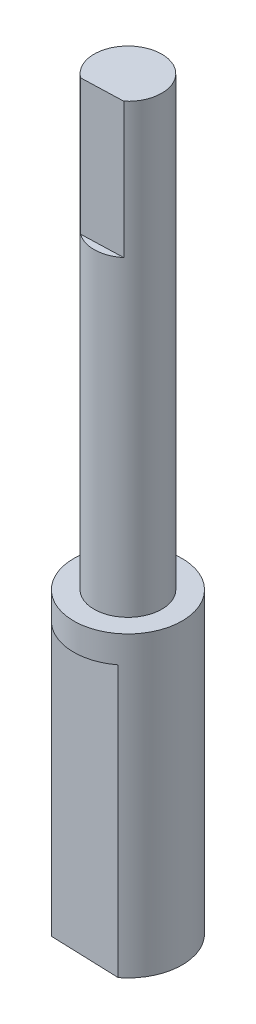
ISO-10303-21;
HEADER;
FILE_DESCRIPTION(('STEP AP214'),'2;1');
FILE_NAME('part.step','',(''),(''),'','','');
FILE_SCHEMA(('AUTOMOTIVE_DESIGN { 1 0 10303 214 1 1 1 1 }'));
ENDSEC;
DATA;
#1=APPLICATION_CONTEXT('core data for automotive mechanical design processes');
#2=APPLICATION_PROTOCOL_DEFINITION('international standard','automotive_design',2000,#1);
#3=PRODUCT_CONTEXT('',#1,'mechanical');
#4=PRODUCT('Part','Part','',(#3));
#5=PRODUCT_RELATED_PRODUCT_CATEGORY('part','',(#4));
#6=PRODUCT_DEFINITION_FORMATION('','',#4);
#7=PRODUCT_DEFINITION_CONTEXT('part definition',#1,'design');
#8=PRODUCT_DEFINITION('design','',#6,#7);
#9=PRODUCT_DEFINITION_SHAPE('','',#8);
#10=(LENGTH_UNIT() NAMED_UNIT(*) SI_UNIT(.MILLI.,.METRE.));
#11=(NAMED_UNIT(*) PLANE_ANGLE_UNIT() SI_UNIT($,.RADIAN.));
#12=(NAMED_UNIT(*) SI_UNIT($,.STERADIAN.) SOLID_ANGLE_UNIT());
#13=UNCERTAINTY_MEASURE_WITH_UNIT(LENGTH_MEASURE(1.E-05),#10,'distance_accuracy_value','');
#14=(GEOMETRIC_REPRESENTATION_CONTEXT(3) GLOBAL_UNCERTAINTY_ASSIGNED_CONTEXT((#13)) GLOBAL_UNIT_ASSIGNED_CONTEXT((#10,
#11,#12)) REPRESENTATION_CONTEXT('',''));
#15=CARTESIAN_POINT('',(0.,0.,0.));
#16=DIRECTION('',(0.,0.,1.));
#17=DIRECTION('',(1.,0.,0.));
#18=AXIS2_PLACEMENT_3D('',#15,#16,#17);
#19=CARTESIAN_POINT('',(0.,55.,0.));
#20=DIRECTION('',(0.,-1.,0.));
#21=DIRECTION('',(0.,0.,-1.));
#22=AXIS2_PLACEMENT_3D('',#19,#20,#21);
#23=CYLINDRICAL_SURFACE('',#22,4.);
#24=CARTESIAN_POINT('',(0.,20.,0.));
#25=DIRECTION('',(0.,-1.,0.));
#26=DIRECTION('',(0.,0.,-1.));
#27=AXIS2_PLACEMENT_3D('',#24,#25,#26);
#28=CIRCLE('',#27,4.);
#29=CARTESIAN_POINT('',(2.44412286649383,20.,3.1664275474866));
#30=VERTEX_POINT('',#29);
#31=CARTESIAN_POINT('',(-2.66133985332202,20.,2.98617986483064));
#32=VERTEX_POINT('',#31);
#33=EDGE_CURVE('E116',#30,#32,#28,.T.);
#34=ORIENTED_EDGE('',*,*,#33,.F.);
#35=DIRECTION('',(0.,-1.,0.));
#36=VECTOR('',#35,1.);
#37=CARTESIAN_POINT('',(2.44412286649383,20.,3.1664275474866));
#38=LINE('',#37,#36);
#39=CARTESIAN_POINT('',(2.44412286649383,0.,3.1664275474866));
#40=VERTEX_POINT('',#39);
#41=EDGE_CURVE('E47',#30,#40,#38,.T.);
#42=ORIENTED_EDGE('',*,*,#41,.T.);
#43=CARTESIAN_POINT('',(0.,0.,0.));
#44=DIRECTION('',(0.,1.,0.));
#45=DIRECTION('',(0.,0.,1.));
#46=AXIS2_PLACEMENT_3D('',#43,#44,#45);
#47=CIRCLE('',#46,4.);
#48=CARTESIAN_POINT('',(-2.66133985332202,0.,2.98617986483064));
#49=VERTEX_POINT('',#48);
#50=EDGE_CURVE('E11',#40,#49,#47,.T.);
#51=ORIENTED_EDGE('',*,*,#50,.T.);
#52=DIRECTION('',(0.,-1.,0.));
#53=VECTOR('',#52,1.);
#54=CARTESIAN_POINT('',(-2.66133985332202,20.,2.98617986483064));
#55=LINE('',#54,#53);
#56=EDGE_CURVE('E62',#32,#49,#55,.T.);
#57=ORIENTED_EDGE('',*,*,#56,.F.);
#58=EDGE_LOOP('',(#34,#42,#51,#57));
#59=FACE_BOUND('',#58,.T.);
#60=CARTESIAN_POINT('',(0.,22.,0.));
#61=DIRECTION('',(0.,1.,0.));
#62=DIRECTION('',(0.,0.,1.));
#63=AXIS2_PLACEMENT_3D('',#60,#61,#62);
#64=CIRCLE('',#63,4.);
#65=CARTESIAN_POINT('',(0.,22.,4.));
#66=VERTEX_POINT('',#65);
#67=EDGE_CURVE('E109',#66,#66,#64,.T.);
#68=ORIENTED_EDGE('',*,*,#67,.F.);
#69=EDGE_LOOP('',(#68));
#70=FACE_BOUND('',#69,.T.);
#71=ADVANCED_FACE('F39',(#59,#70),#23,.T.);
#72=CARTESIAN_POINT('',(0.,0.,0.));
#73=DIRECTION('',(0.,1.,0.));
#74=DIRECTION('',(0.,0.,1.));
#75=AXIS2_PLACEMENT_3D('',#72,#73,#74);
#76=PLANE('',#75);
#77=ORIENTED_EDGE('',*,*,#50,.F.);
#78=DIRECTION('',(0.999377365174894,0.,0.0352828850306625));
#79=VECTOR('',#78,1.);
#80=CARTESIAN_POINT('',(-2.66133985332202,0.,2.98617986483064));
#81=LINE('',#80,#79);
#82=EDGE_CURVE('E115',#49,#40,#81,.T.);
#83=ORIENTED_EDGE('',*,*,#82,.F.);
#84=EDGE_LOOP('',(#77,#83));
#85=FACE_BOUND('',#84,.T.);
#86=ADVANCED_FACE('F133',(#85),#76,.F.);
#87=CARTESIAN_POINT('',(-2.66133985332202,20.,2.98617986483064));
#88=DIRECTION('',(0.0352828850306625,0.,-0.999377365174894));
#89=DIRECTION('',(-0.999377365174894,0.,-0.0352828850306625));
#90=AXIS2_PLACEMENT_3D('',#87,#88,#89);
#91=PLANE('',#90);
#92=ORIENTED_EDGE('',*,*,#82,.T.);
#93=ORIENTED_EDGE('',*,*,#41,.F.);
#94=DIRECTION('',(0.999377365174894,0.,0.0352828850306625));
#95=VECTOR('',#94,1.);
#96=CARTESIAN_POINT('',(-2.66133985332202,20.,2.98617986483064));
#97=LINE('',#96,#95);
#98=EDGE_CURVE('E119',#32,#30,#97,.T.);
#99=ORIENTED_EDGE('',*,*,#98,.F.);
#100=ORIENTED_EDGE('',*,*,#56,.T.);
#101=EDGE_LOOP('',(#92,#93,#99,#100));
#102=FACE_BOUND('',#101,.T.);
#103=ADVANCED_FACE('F134',(#102),#91,.F.);
#104=CARTESIAN_POINT('',(0.,20.,0.));
#105=DIRECTION('',(0.,-1.,0.));
#106=DIRECTION('',(0.,0.,-1.));
#107=AXIS2_PLACEMENT_3D('',#104,#105,#106);
#108=PLANE('',#107);
#109=ORIENTED_EDGE('',*,*,#33,.T.);
#110=ORIENTED_EDGE('',*,*,#98,.T.);
#111=EDGE_LOOP('',(#109,#110));
#112=FACE_BOUND('',#111,.T.);
#113=ADVANCED_FACE('F136',(#112),#108,.T.);
#114=CARTESIAN_POINT('',(0.,22.,0.));
#115=DIRECTION('',(0.,1.,0.));
#116=DIRECTION('',(0.,0.,1.));
#117=AXIS2_PLACEMENT_3D('',#114,#115,#116);
#118=PLANE('',#117);
#119=CARTESIAN_POINT('',(0.,22.,0.));
#120=DIRECTION('',(0.,1.,0.));
#121=DIRECTION('',(0.,0.,1.));
#122=AXIS2_PLACEMENT_3D('',#119,#120,#121);
#123=CIRCLE('',#122,2.5);
#124=CARTESIAN_POINT('',(0.,22.,2.5));
#125=VERTEX_POINT('',#124);
#126=EDGE_CURVE('E105',#125,#125,#123,.T.);
#127=ORIENTED_EDGE('',*,*,#126,.F.);
#128=EDGE_LOOP('',(#127));
#129=FACE_BOUND('',#128,.T.);
#130=ORIENTED_EDGE('',*,*,#67,.T.);
#131=EDGE_LOOP('',(#130));
#132=FACE_BOUND('',#131,.T.);
#133=ADVANCED_FACE('F142',(#129,#132),#118,.T.);
#134=CARTESIAN_POINT('',(0.,22.,0.));
#135=DIRECTION('',(0.,1.,0.));
#136=DIRECTION('',(0.,0.,1.));
#137=AXIS2_PLACEMENT_3D('',#134,#135,#136);
#138=CYLINDRICAL_SURFACE('',#137,2.5);
#139=DIRECTION('',(0.,1.,0.));
#140=VECTOR('',#139,1.);
#141=CARTESIAN_POINT('',(-1.47925730401407,45.,2.0153902422412));
#142=LINE('',#141,#140);
#143=CARTESIAN_POINT('',(-1.47925730401407,45.,2.0153902422412));
#144=VERTEX_POINT('',#143);
#145=CARTESIAN_POINT('',(-1.47925730401407,55.,2.0153902422412));
#146=VERTEX_POINT('',#145);
#147=EDGE_CURVE('E91',#144,#146,#142,.T.);
#148=ORIENTED_EDGE('',*,*,#147,.T.);
#149=CARTESIAN_POINT('',(0.,55.,0.));
#150=DIRECTION('',(0.,1.,0.));
#151=DIRECTION('',(0.,0.,1.));
#152=AXIS2_PLACEMENT_3D('',#149,#150,#151);
#153=CIRCLE('',#152,2.5);
#154=CARTESIAN_POINT('',(1.60697378754268,55.,1.91510711088198));
#155=VERTEX_POINT('',#154);
#156=EDGE_CURVE('E98',#155,#146,#153,.T.);
#157=ORIENTED_EDGE('',*,*,#156,.F.);
#158=DIRECTION('',(0.,1.,0.));
#159=VECTOR('',#158,1.);
#160=CARTESIAN_POINT('',(1.60697378754268,45.,1.91510711088198));
#161=LINE('',#160,#159);
#162=CARTESIAN_POINT('',(1.60697378754268,45.,1.91510711088198));
#163=VERTEX_POINT('',#162);
#164=EDGE_CURVE('E54',#163,#155,#161,.T.);
#165=ORIENTED_EDGE('',*,*,#164,.F.);
#166=CARTESIAN_POINT('',(0.,45.,0.));
#167=DIRECTION('',(0.,1.,0.));
#168=DIRECTION('',(0.,0.,1.));
#169=AXIS2_PLACEMENT_3D('',#166,#167,#168);
#170=CIRCLE('',#169,2.5);
#171=EDGE_CURVE('E82',#144,#163,#170,.T.);
#172=ORIENTED_EDGE('',*,*,#171,.F.);
#173=EDGE_LOOP('',(#148,#157,#165,#172));
#174=FACE_BOUND('',#173,.T.);
#175=ORIENTED_EDGE('',*,*,#126,.T.);
#176=EDGE_LOOP('',(#175));
#177=FACE_BOUND('',#176,.T.);
#178=ADVANCED_FACE('F95',(#174,#177),#138,.T.);
#179=CARTESIAN_POINT('',(0.,55.,0.));
#180=DIRECTION('',(0.,1.,0.));
#181=DIRECTION('',(0.,0.,1.));
#182=AXIS2_PLACEMENT_3D('',#179,#180,#181);
#183=PLANE('',#182);
#184=DIRECTION('',(-0.999472496738152,0.,0.0324765802387651));
#185=VECTOR('',#184,1.);
#186=CARTESIAN_POINT('',(-1.47925730401407,55.,2.0153902422412));
#187=LINE('',#186,#185);
#188=EDGE_CURVE('E88',#155,#146,#187,.T.);
#189=ORIENTED_EDGE('',*,*,#188,.F.);
#190=ORIENTED_EDGE('',*,*,#156,.T.);
#191=EDGE_LOOP('',(#189,#190));
#192=FACE_BOUND('',#191,.T.);
#193=ADVANCED_FACE('F179',(#192),#183,.T.);
#194=CARTESIAN_POINT('',(-1.47925730401407,45.,2.0153902422412));
#195=DIRECTION('',(-0.0324765802387651,0.,-0.999472496738152));
#196=DIRECTION('',(-0.999472496738152,0.,0.0324765802387651));
#197=AXIS2_PLACEMENT_3D('',#194,#195,#196);
#198=PLANE('',#197);
#199=ORIENTED_EDGE('',*,*,#188,.T.);
#200=ORIENTED_EDGE('',*,*,#147,.F.);
#201=DIRECTION('',(-0.999472496738152,0.,0.0324765802387651));
#202=VECTOR('',#201,1.);
#203=CARTESIAN_POINT('',(-1.47925730401407,45.,2.0153902422412));
#204=LINE('',#203,#202);
#205=EDGE_CURVE('E84',#163,#144,#204,.T.);
#206=ORIENTED_EDGE('',*,*,#205,.F.);
#207=ORIENTED_EDGE('',*,*,#164,.T.);
#208=EDGE_LOOP('',(#199,#200,#206,#207));
#209=FACE_BOUND('',#208,.T.);
#210=ADVANCED_FACE('F90',(#209),#198,.F.);
#211=CARTESIAN_POINT('',(0.,45.,0.));
#212=DIRECTION('',(0.,1.,0.));
#213=DIRECTION('',(0.,0.,1.));
#214=AXIS2_PLACEMENT_3D('',#211,#212,#213);
#215=PLANE('',#214);
#216=ORIENTED_EDGE('',*,*,#171,.T.);
#217=ORIENTED_EDGE('',*,*,#205,.T.);
#218=EDGE_LOOP('',(#216,#217));
#219=FACE_BOUND('',#218,.T.);
#220=ADVANCED_FACE('F83',(#219),#215,.T.);
#221=CLOSED_SHELL('',(#71,#86,#103,#113,#133,#178,#193,#210,#220));
#222=MANIFOLD_SOLID_BREP('B2',#221);
#223=ADVANCED_BREP_SHAPE_REPRESENTATION('',(#18,#222),#14);
#224=SHAPE_DEFINITION_REPRESENTATION(#9,#223);
ENDSEC;
END-ISO-10303-21;
